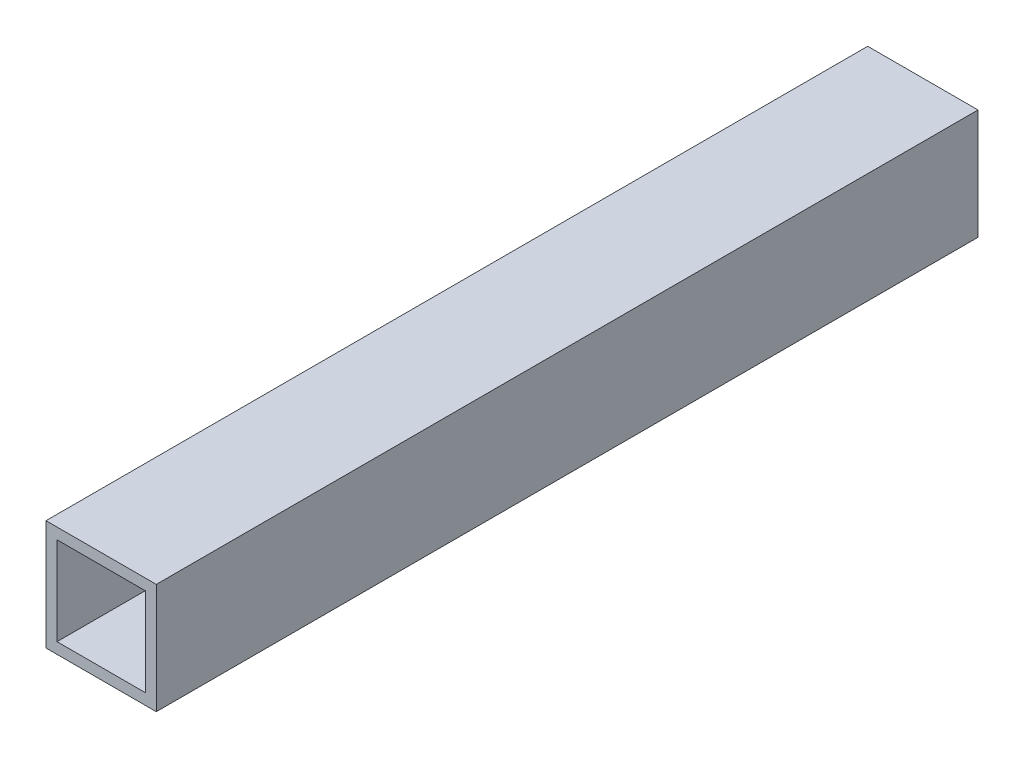
ISO-10303-21;
HEADER;
FILE_DESCRIPTION(('STEP AP214'),'2;1');
FILE_NAME('part.step','',(''),(''),'','','');
FILE_SCHEMA(('AUTOMOTIVE_DESIGN { 1 0 10303 214 1 1 1 1 }'));
ENDSEC;
DATA;
#1=APPLICATION_CONTEXT('core data for automotive mechanical design processes');
#2=APPLICATION_PROTOCOL_DEFINITION('international standard','automotive_design',2000,#1);
#3=PRODUCT_CONTEXT('',#1,'mechanical');
#4=PRODUCT('Part','Part','',(#3));
#5=PRODUCT_RELATED_PRODUCT_CATEGORY('part','',(#4));
#6=PRODUCT_DEFINITION_FORMATION('','',#4);
#7=PRODUCT_DEFINITION_CONTEXT('part definition',#1,'design');
#8=PRODUCT_DEFINITION('design','',#6,#7);
#9=PRODUCT_DEFINITION_SHAPE('','',#8);
#10=(LENGTH_UNIT() NAMED_UNIT(*) SI_UNIT(.MILLI.,.METRE.));
#11=(NAMED_UNIT(*) PLANE_ANGLE_UNIT() SI_UNIT($,.RADIAN.));
#12=(NAMED_UNIT(*) SI_UNIT($,.STERADIAN.) SOLID_ANGLE_UNIT());
#13=UNCERTAINTY_MEASURE_WITH_UNIT(LENGTH_MEASURE(1.E-05),#10,'distance_accuracy_value','');
#14=(GEOMETRIC_REPRESENTATION_CONTEXT(3) GLOBAL_UNCERTAINTY_ASSIGNED_CONTEXT((#13)) GLOBAL_UNIT_ASSIGNED_CONTEXT((#10,
#11,#12)) REPRESENTATION_CONTEXT('',''));
#15=CARTESIAN_POINT('',(0.,0.,0.));
#16=DIRECTION('',(0.,0.,1.));
#17=DIRECTION('',(1.,0.,0.));
#18=AXIS2_PLACEMENT_3D('',#15,#16,#17);
#19=CARTESIAN_POINT('',(0.,0.,298.));
#20=DIRECTION('',(0.,0.,1.));
#21=DIRECTION('',(1.,0.,0.));
#22=AXIS2_PLACEMENT_3D('',#19,#20,#21);
#23=PLANE('',#22);
#24=DIRECTION('',(0.,-1.,0.));
#25=VECTOR('',#24,1.);
#26=CARTESIAN_POINT('',(0.,0.,298.));
#27=LINE('',#26,#25);
#28=CARTESIAN_POINT('',(0.,40.,298.));
#29=VERTEX_POINT('',#28);
#30=CARTESIAN_POINT('',(0.,0.,298.));
#31=VERTEX_POINT('',#30);
#32=EDGE_CURVE('E160',#29,#31,#27,.T.);
#33=ORIENTED_EDGE('',*,*,#32,.T.);
#34=DIRECTION('',(1.,0.,0.));
#35=VECTOR('',#34,1.);
#36=CARTESIAN_POINT('',(0.,0.,298.));
#37=LINE('',#36,#35);
#38=CARTESIAN_POINT('',(40.,0.,298.));
#39=VERTEX_POINT('',#38);
#40=EDGE_CURVE('E163',#31,#39,#37,.T.);
#41=ORIENTED_EDGE('',*,*,#40,.T.);
#42=DIRECTION('',(0.,1.,0.));
#43=VECTOR('',#42,1.);
#44=CARTESIAN_POINT('',(40.,0.,298.));
#45=LINE('',#44,#43);
#46=CARTESIAN_POINT('',(40.,40.,298.));
#47=VERTEX_POINT('',#46);
#48=EDGE_CURVE('E166',#39,#47,#45,.T.);
#49=ORIENTED_EDGE('',*,*,#48,.T.);
#50=DIRECTION('',(-1.,0.,0.));
#51=VECTOR('',#50,1.);
#52=CARTESIAN_POINT('',(0.,40.,298.));
#53=LINE('',#52,#51);
#54=EDGE_CURVE('E168',#47,#29,#53,.T.);
#55=ORIENTED_EDGE('',*,*,#54,.T.);
#56=EDGE_LOOP('',(#33,#41,#49,#55));
#57=FACE_BOUND('',#56,.T.);
#58=DIRECTION('',(1.,0.,0.));
#59=VECTOR('',#58,1.);
#60=CARTESIAN_POINT('',(0.,4.,298.));
#61=LINE('',#60,#59);
#62=CARTESIAN_POINT('',(4.,4.,298.));
#63=VERTEX_POINT('',#62);
#64=CARTESIAN_POINT('',(36.,4.,298.));
#65=VERTEX_POINT('',#64);
#66=EDGE_CURVE('E132',#63,#65,#61,.T.);
#67=ORIENTED_EDGE('',*,*,#66,.F.);
#68=DIRECTION('',(0.,-1.,0.));
#69=VECTOR('',#68,1.);
#70=CARTESIAN_POINT('',(4.,40.,298.));
#71=LINE('',#70,#69);
#72=CARTESIAN_POINT('',(4.,36.,298.));
#73=VERTEX_POINT('',#72);
#74=EDGE_CURVE('E124',#73,#63,#71,.T.);
#75=ORIENTED_EDGE('',*,*,#74,.F.);
#76=DIRECTION('',(-1.,0.,0.));
#77=VECTOR('',#76,1.);
#78=CARTESIAN_POINT('',(0.,36.,298.));
#79=LINE('',#78,#77);
#80=CARTESIAN_POINT('',(36.,36.,298.));
#81=VERTEX_POINT('',#80);
#82=EDGE_CURVE('E146',#81,#73,#79,.T.);
#83=ORIENTED_EDGE('',*,*,#82,.F.);
#84=DIRECTION('',(0.,1.,0.));
#85=VECTOR('',#84,1.);
#86=CARTESIAN_POINT('',(36.,40.,298.));
#87=LINE('',#86,#85);
#88=EDGE_CURVE('E144',#65,#81,#87,.T.);
#89=ORIENTED_EDGE('',*,*,#88,.F.);
#90=EDGE_LOOP('',(#67,#75,#83,#89));
#91=FACE_BOUND('',#90,.T.);
#92=ADVANCED_FACE('F59',(#57,#91),#23,.T.);
#93=CARTESIAN_POINT('',(0.,0.,0.));
#94=DIRECTION('',(0.,0.,1.));
#95=DIRECTION('',(1.,0.,0.));
#96=AXIS2_PLACEMENT_3D('',#93,#94,#95);
#97=PLANE('',#96);
#98=DIRECTION('',(0.,-1.,0.));
#99=VECTOR('',#98,1.);
#100=CARTESIAN_POINT('',(0.,0.,0.));
#101=LINE('',#100,#99);
#102=CARTESIAN_POINT('',(0.,40.,0.));
#103=VERTEX_POINT('',#102);
#104=CARTESIAN_POINT('',(0.,0.,0.));
#105=VERTEX_POINT('',#104);
#106=EDGE_CURVE('E140',#103,#105,#101,.T.);
#107=ORIENTED_EDGE('',*,*,#106,.F.);
#108=DIRECTION('',(-1.,0.,0.));
#109=VECTOR('',#108,1.);
#110=CARTESIAN_POINT('',(0.,40.,0.));
#111=LINE('',#110,#109);
#112=CARTESIAN_POINT('',(40.,40.,0.));
#113=VERTEX_POINT('',#112);
#114=EDGE_CURVE('E164',#113,#103,#111,.T.);
#115=ORIENTED_EDGE('',*,*,#114,.F.);
#116=DIRECTION('',(0.,1.,0.));
#117=VECTOR('',#116,1.);
#118=CARTESIAN_POINT('',(40.,0.,0.));
#119=LINE('',#118,#117);
#120=CARTESIAN_POINT('',(40.,0.,0.));
#121=VERTEX_POINT('',#120);
#122=EDGE_CURVE('E175',#121,#113,#119,.T.);
#123=ORIENTED_EDGE('',*,*,#122,.F.);
#124=DIRECTION('',(1.,0.,0.));
#125=VECTOR('',#124,1.);
#126=CARTESIAN_POINT('',(0.,0.,0.));
#127=LINE('',#126,#125);
#128=EDGE_CURVE('E173',#105,#121,#127,.T.);
#129=ORIENTED_EDGE('',*,*,#128,.F.);
#130=EDGE_LOOP('',(#107,#115,#123,#129));
#131=FACE_BOUND('',#130,.T.);
#132=DIRECTION('',(0.,-1.,0.));
#133=VECTOR('',#132,1.);
#134=CARTESIAN_POINT('',(4.,40.,0.));
#135=LINE('',#134,#133);
#136=CARTESIAN_POINT('',(4.,36.,0.));
#137=VERTEX_POINT('',#136);
#138=CARTESIAN_POINT('',(4.,4.,0.));
#139=VERTEX_POINT('',#138);
#140=EDGE_CURVE('E82',#137,#139,#135,.T.);
#141=ORIENTED_EDGE('',*,*,#140,.T.);
#142=DIRECTION('',(1.,0.,0.));
#143=VECTOR('',#142,1.);
#144=CARTESIAN_POINT('',(0.,4.,0.));
#145=LINE('',#144,#143);
#146=CARTESIAN_POINT('',(36.,4.,0.));
#147=VERTEX_POINT('',#146);
#148=EDGE_CURVE('E139',#139,#147,#145,.T.);
#149=ORIENTED_EDGE('',*,*,#148,.T.);
#150=DIRECTION('',(0.,1.,0.));
#151=VECTOR('',#150,1.);
#152=CARTESIAN_POINT('',(36.,40.,0.));
#153=LINE('',#152,#151);
#154=CARTESIAN_POINT('',(36.,36.,0.));
#155=VERTEX_POINT('',#154);
#156=EDGE_CURVE('E152',#147,#155,#153,.T.);
#157=ORIENTED_EDGE('',*,*,#156,.T.);
#158=DIRECTION('',(-1.,0.,0.));
#159=VECTOR('',#158,1.);
#160=CARTESIAN_POINT('',(0.,36.,0.));
#161=LINE('',#160,#159);
#162=EDGE_CURVE('E133',#155,#137,#161,.T.);
#163=ORIENTED_EDGE('',*,*,#162,.T.);
#164=EDGE_LOOP('',(#141,#149,#157,#163));
#165=FACE_BOUND('',#164,.T.);
#166=ADVANCED_FACE('F193',(#131,#165),#97,.F.);
#167=CARTESIAN_POINT('',(0.,0.,298.));
#168=DIRECTION('',(1.,0.,0.));
#169=DIRECTION('',(0.,0.,-1.));
#170=AXIS2_PLACEMENT_3D('',#167,#168,#169);
#171=PLANE('',#170);
#172=ORIENTED_EDGE('',*,*,#106,.T.);
#173=DIRECTION('',(0.,0.,-1.));
#174=VECTOR('',#173,1.);
#175=CARTESIAN_POINT('',(0.,0.,298.));
#176=LINE('',#175,#174);
#177=EDGE_CURVE('E12',#31,#105,#176,.T.);
#178=ORIENTED_EDGE('',*,*,#177,.F.);
#179=ORIENTED_EDGE('',*,*,#32,.F.);
#180=DIRECTION('',(0.,0.,-1.));
#181=VECTOR('',#180,1.);
#182=CARTESIAN_POINT('',(0.,40.,298.));
#183=LINE('',#182,#181);
#184=EDGE_CURVE('E170',#29,#103,#183,.T.);
#185=ORIENTED_EDGE('',*,*,#184,.T.);
#186=EDGE_LOOP('',(#172,#178,#179,#185));
#187=FACE_BOUND('',#186,.T.);
#188=ADVANCED_FACE('F61',(#187),#171,.F.);
#189=CARTESIAN_POINT('',(0.,0.,298.));
#190=DIRECTION('',(0.,1.,0.));
#191=DIRECTION('',(0.,0.,1.));
#192=AXIS2_PLACEMENT_3D('',#189,#190,#191);
#193=PLANE('',#192);
#194=ORIENTED_EDGE('',*,*,#128,.T.);
#195=DIRECTION('',(0.,0.,-1.));
#196=VECTOR('',#195,1.);
#197=CARTESIAN_POINT('',(40.,0.,298.));
#198=LINE('',#197,#196);
#199=EDGE_CURVE('E67',#39,#121,#198,.T.);
#200=ORIENTED_EDGE('',*,*,#199,.F.);
#201=ORIENTED_EDGE('',*,*,#40,.F.);
#202=ORIENTED_EDGE('',*,*,#177,.T.);
#203=EDGE_LOOP('',(#194,#200,#201,#202));
#204=FACE_BOUND('',#203,.T.);
#205=ADVANCED_FACE('F203',(#204),#193,.F.);
#206=CARTESIAN_POINT('',(40.,0.,298.));
#207=DIRECTION('',(-1.,0.,0.));
#208=DIRECTION('',(0.,0.,1.));
#209=AXIS2_PLACEMENT_3D('',#206,#207,#208);
#210=PLANE('',#209);
#211=ORIENTED_EDGE('',*,*,#122,.T.);
#212=DIRECTION('',(0.,0.,-1.));
#213=VECTOR('',#212,1.);
#214=CARTESIAN_POINT('',(40.,40.,298.));
#215=LINE('',#214,#213);
#216=EDGE_CURVE('E180',#47,#113,#215,.T.);
#217=ORIENTED_EDGE('',*,*,#216,.F.);
#218=ORIENTED_EDGE('',*,*,#48,.F.);
#219=ORIENTED_EDGE('',*,*,#199,.T.);
#220=EDGE_LOOP('',(#211,#217,#218,#219));
#221=FACE_BOUND('',#220,.T.);
#222=ADVANCED_FACE('F187',(#221),#210,.F.);
#223=CARTESIAN_POINT('',(0.,40.,298.));
#224=DIRECTION('',(0.,-1.,0.));
#225=DIRECTION('',(0.,0.,-1.));
#226=AXIS2_PLACEMENT_3D('',#223,#224,#225);
#227=PLANE('',#226);
#228=ORIENTED_EDGE('',*,*,#114,.T.);
#229=ORIENTED_EDGE('',*,*,#184,.F.);
#230=ORIENTED_EDGE('',*,*,#54,.F.);
#231=ORIENTED_EDGE('',*,*,#216,.T.);
#232=EDGE_LOOP('',(#228,#229,#230,#231));
#233=FACE_BOUND('',#232,.T.);
#234=ADVANCED_FACE('F197',(#233),#227,.F.);
#235=CARTESIAN_POINT('',(4.,40.,298.));
#236=DIRECTION('',(1.,0.,0.));
#237=DIRECTION('',(0.,0.,-1.));
#238=AXIS2_PLACEMENT_3D('',#235,#236,#237);
#239=PLANE('',#238);
#240=ORIENTED_EDGE('',*,*,#140,.F.);
#241=DIRECTION('',(0.,0.,-1.));
#242=VECTOR('',#241,1.);
#243=CARTESIAN_POINT('',(4.,36.,298.));
#244=LINE('',#243,#242);
#245=EDGE_CURVE('E128',#73,#137,#244,.T.);
#246=ORIENTED_EDGE('',*,*,#245,.F.);
#247=ORIENTED_EDGE('',*,*,#74,.T.);
#248=DIRECTION('',(0.,0.,-1.));
#249=VECTOR('',#248,1.);
#250=CARTESIAN_POINT('',(4.,4.,298.));
#251=LINE('',#250,#249);
#252=EDGE_CURVE('E127',#63,#139,#251,.T.);
#253=ORIENTED_EDGE('',*,*,#252,.T.);
#254=EDGE_LOOP('',(#240,#246,#247,#253));
#255=FACE_BOUND('',#254,.T.);
#256=ADVANCED_FACE('F126',(#255),#239,.T.);
#257=CARTESIAN_POINT('',(0.,4.,298.));
#258=DIRECTION('',(0.,1.,0.));
#259=DIRECTION('',(0.,0.,1.));
#260=AXIS2_PLACEMENT_3D('',#257,#258,#259);
#261=PLANE('',#260);
#262=ORIENTED_EDGE('',*,*,#148,.F.);
#263=ORIENTED_EDGE('',*,*,#252,.F.);
#264=ORIENTED_EDGE('',*,*,#66,.T.);
#265=DIRECTION('',(0.,0.,-1.));
#266=VECTOR('',#265,1.);
#267=CARTESIAN_POINT('',(36.,4.,298.));
#268=LINE('',#267,#266);
#269=EDGE_CURVE('E141',#65,#147,#268,.T.);
#270=ORIENTED_EDGE('',*,*,#269,.T.);
#271=EDGE_LOOP('',(#262,#263,#264,#270));
#272=FACE_BOUND('',#271,.T.);
#273=ADVANCED_FACE('F136',(#272),#261,.T.);
#274=CARTESIAN_POINT('',(36.,40.,298.));
#275=DIRECTION('',(-1.,0.,0.));
#276=DIRECTION('',(0.,0.,1.));
#277=AXIS2_PLACEMENT_3D('',#274,#275,#276);
#278=PLANE('',#277);
#279=ORIENTED_EDGE('',*,*,#156,.F.);
#280=ORIENTED_EDGE('',*,*,#269,.F.);
#281=ORIENTED_EDGE('',*,*,#88,.T.);
#282=DIRECTION('',(0.,0.,-1.));
#283=VECTOR('',#282,1.);
#284=CARTESIAN_POINT('',(36.,36.,298.));
#285=LINE('',#284,#283);
#286=EDGE_CURVE('E74',#81,#155,#285,.T.);
#287=ORIENTED_EDGE('',*,*,#286,.T.);
#288=EDGE_LOOP('',(#279,#280,#281,#287));
#289=FACE_BOUND('',#288,.T.);
#290=ADVANCED_FACE('F226',(#289),#278,.T.);
#291=CARTESIAN_POINT('',(0.,36.,298.));
#292=DIRECTION('',(0.,-1.,0.));
#293=DIRECTION('',(0.,0.,-1.));
#294=AXIS2_PLACEMENT_3D('',#291,#292,#293);
#295=PLANE('',#294);
#296=ORIENTED_EDGE('',*,*,#162,.F.);
#297=ORIENTED_EDGE('',*,*,#286,.F.);
#298=ORIENTED_EDGE('',*,*,#82,.T.);
#299=ORIENTED_EDGE('',*,*,#245,.T.);
#300=EDGE_LOOP('',(#296,#297,#298,#299));
#301=FACE_BOUND('',#300,.T.);
#302=ADVANCED_FACE('F230',(#301),#295,.T.);
#303=CLOSED_SHELL('',(#92,#166,#188,#205,#222,#234,#256,#273,#290,#302));
#304=MANIFOLD_SOLID_BREP('B2',#303);
#305=ADVANCED_BREP_SHAPE_REPRESENTATION('',(#18,#304),#14);
#306=SHAPE_DEFINITION_REPRESENTATION(#9,#305);
ENDSEC;
END-ISO-10303-21;
